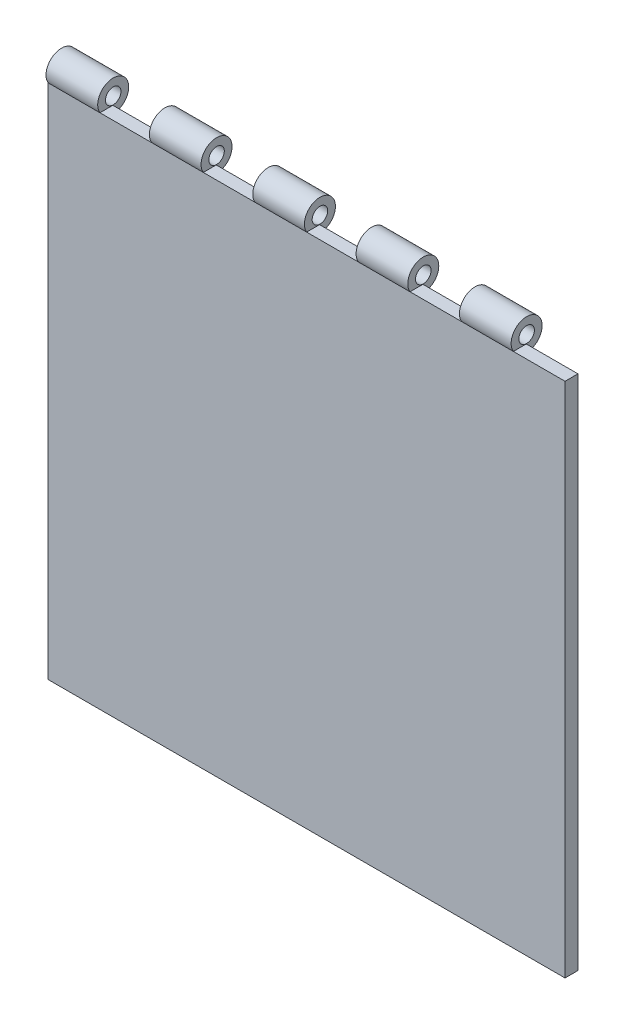
ISO-10303-21;
HEADER;
FILE_DESCRIPTION(('STEP AP214'),'2;1');
FILE_NAME('part.step','',(''),(''),'','','');
FILE_SCHEMA(('AUTOMOTIVE_DESIGN { 1 0 10303 214 1 1 1 1 }'));
ENDSEC;
DATA;
#1=APPLICATION_CONTEXT('core data for automotive mechanical design processes');
#2=APPLICATION_PROTOCOL_DEFINITION('international standard','automotive_design',2000,#1);
#3=PRODUCT_CONTEXT('',#1,'mechanical');
#4=PRODUCT('Part','Part','',(#3));
#5=PRODUCT_RELATED_PRODUCT_CATEGORY('part','',(#4));
#6=PRODUCT_DEFINITION_FORMATION('','',#4);
#7=PRODUCT_DEFINITION_CONTEXT('part definition',#1,'design');
#8=PRODUCT_DEFINITION('design','',#6,#7);
#9=PRODUCT_DEFINITION_SHAPE('','',#8);
#10=(LENGTH_UNIT() NAMED_UNIT(*) SI_UNIT(.MILLI.,.METRE.));
#11=(NAMED_UNIT(*) PLANE_ANGLE_UNIT() SI_UNIT($,.RADIAN.));
#12=(NAMED_UNIT(*) SI_UNIT($,.STERADIAN.) SOLID_ANGLE_UNIT());
#13=UNCERTAINTY_MEASURE_WITH_UNIT(LENGTH_MEASURE(1.E-05),#10,'distance_accuracy_value','');
#14=(GEOMETRIC_REPRESENTATION_CONTEXT(3) GLOBAL_UNCERTAINTY_ASSIGNED_CONTEXT((#13)) GLOBAL_UNIT_ASSIGNED_CONTEXT((#10,
#11,#12)) REPRESENTATION_CONTEXT('',''));
#15=CARTESIAN_POINT('',(0.,0.,0.));
#16=DIRECTION('',(0.,0.,1.));
#17=DIRECTION('',(1.,0.,0.));
#18=AXIS2_PLACEMENT_3D('',#15,#16,#17);
#19=CARTESIAN_POINT('',(12.6542998422668,241.773790352499,2.8441251796313));
#20=DIRECTION('',(0.,-1.,0.));
#21=DIRECTION('',(0.,0.,-1.));
#22=AXIS2_PLACEMENT_3D('',#19,#20,#21);
#23=PLANE('',#22);
#24=DIRECTION('',(0.,0.,-1.));
#25=VECTOR('',#24,1.);
#26=CARTESIAN_POINT('',(218.394299842267,241.773790352499,2.8441251796313));
#27=LINE('',#26,#25);
#28=CARTESIAN_POINT('',(218.394299842267,241.773790352499,2.8441251796313));
#29=VERTEX_POINT('',#28);
#30=CARTESIAN_POINT('',(218.394299842267,241.773790352499,-2.8708748203687));
#31=VERTEX_POINT('',#30);
#32=EDGE_CURVE('E164',#29,#31,#27,.T.);
#33=ORIENTED_EDGE('',*,*,#32,.F.);
#34=DIRECTION('',(-1.,0.,0.));
#35=VECTOR('',#34,1.);
#36=CARTESIAN_POINT('',(12.6542998422668,241.773790352499,2.8441251796313));
#37=LINE('',#36,#35);
#38=CARTESIAN_POINT('',(241.254299842267,241.773790352499,2.8441251796313));
#39=VERTEX_POINT('',#38);
#40=EDGE_CURVE('E279',#39,#29,#37,.T.);
#41=ORIENTED_EDGE('',*,*,#40,.F.);
#42=DIRECTION('',(0.,0.,-1.));
#43=VECTOR('',#42,1.);
#44=CARTESIAN_POINT('',(241.254299842267,241.773790352499,2.8441251796313));
#45=LINE('',#44,#43);
#46=CARTESIAN_POINT('',(241.254299842267,241.773790352499,-2.8708748203687));
#47=VERTEX_POINT('',#46);
#48=EDGE_CURVE('E282',#39,#47,#45,.T.);
#49=ORIENTED_EDGE('',*,*,#48,.T.);
#50=DIRECTION('',(-1.,0.,0.));
#51=VECTOR('',#50,1.);
#52=CARTESIAN_POINT('',(12.6542998422668,241.773790352499,-2.8708748203687));
#53=LINE('',#52,#51);
#54=EDGE_CURVE('E274',#47,#31,#53,.T.);
#55=ORIENTED_EDGE('',*,*,#54,.T.);
#56=EDGE_LOOP('',(#33,#41,#49,#55));
#57=FACE_BOUND('',#56,.T.);
#58=ADVANCED_FACE('F34',(#57),#23,.F.);
#59=CARTESIAN_POINT('',(12.6542998422669,13.1737903524993,-2.8708748203687));
#60=DIRECTION('',(0.,0.,-1.));
#61=DIRECTION('',(-1.,0.,0.));
#62=AXIS2_PLACEMENT_3D('',#59,#60,#61);
#63=PLANE('',#62);
#64=DIRECTION('',(-1.,0.,0.));
#65=VECTOR('',#64,1.);
#66=CARTESIAN_POINT('',(218.394299842267,238.451605653609,-2.8708748203687));
#67=LINE('',#66,#65);
#68=CARTESIAN_POINT('',(218.394299842267,238.451605653609,-2.8708748203687));
#69=VERTEX_POINT('',#68);
#70=CARTESIAN_POINT('',(195.534299842267,238.451605653609,-2.8708748203687));
#71=VERTEX_POINT('',#70);
#72=EDGE_CURVE('E156',#69,#71,#67,.T.);
#73=ORIENTED_EDGE('',*,*,#72,.F.);
#74=DIRECTION('',(0.,1.,0.));
#75=VECTOR('',#74,1.);
#76=CARTESIAN_POINT('',(218.394299842267,13.1737903524994,-2.8708748203687));
#77=LINE('',#76,#75);
#78=EDGE_CURVE('E179',#69,#31,#77,.T.);
#79=ORIENTED_EDGE('',*,*,#78,.T.);
#80=ORIENTED_EDGE('',*,*,#54,.F.);
#81=DIRECTION('',(0.,1.,0.));
#82=VECTOR('',#81,1.);
#83=CARTESIAN_POINT('',(241.254299842267,13.1737903524993,-2.8708748203687));
#84=LINE('',#83,#82);
#85=CARTESIAN_POINT('',(241.254299842267,13.1737903524993,-2.8708748203687));
#86=VERTEX_POINT('',#85);
#87=EDGE_CURVE('E288',#86,#47,#84,.T.);
#88=ORIENTED_EDGE('',*,*,#87,.F.);
#89=DIRECTION('',(1.,0.,0.));
#90=VECTOR('',#89,1.);
#91=CARTESIAN_POINT('',(12.6542998422669,13.1737903524993,-2.8708748203687));
#92=LINE('',#91,#90);
#93=CARTESIAN_POINT('',(12.6542998422669,13.1737903524993,-2.8708748203687));
#94=VERTEX_POINT('',#93);
#95=EDGE_CURVE('E286',#94,#86,#92,.T.);
#96=ORIENTED_EDGE('',*,*,#95,.F.);
#97=DIRECTION('',(0.,-1.,0.));
#98=VECTOR('',#97,1.);
#99=CARTESIAN_POINT('',(12.6542998422669,13.1737903524993,-2.8708748203687));
#100=LINE('',#99,#98);
#101=CARTESIAN_POINT('',(12.6542998422668,238.451605653609,-2.8708748203687));
#102=VERTEX_POINT('',#101);
#103=EDGE_CURVE('E269',#102,#94,#100,.T.);
#104=ORIENTED_EDGE('',*,*,#103,.F.);
#105=DIRECTION('',(-1.,0.,0.));
#106=VECTOR('',#105,1.);
#107=CARTESIAN_POINT('',(35.5142998422669,238.451605653609,-2.8708748203687));
#108=LINE('',#107,#106);
#109=CARTESIAN_POINT('',(35.5142998422669,238.451605653609,-2.8708748203687));
#110=VERTEX_POINT('',#109);
#111=EDGE_CURVE('E304',#110,#102,#108,.T.);
#112=ORIENTED_EDGE('',*,*,#111,.F.);
#113=DIRECTION('',(0.,1.,0.));
#114=VECTOR('',#113,1.);
#115=CARTESIAN_POINT('',(35.514299842267,13.1737903524993,-2.8708748203687));
#116=LINE('',#115,#114);
#117=CARTESIAN_POINT('',(35.5142998422669,241.773790352499,-2.8708748203687));
#118=VERTEX_POINT('',#117);
#119=EDGE_CURVE('E301',#110,#118,#116,.T.);
#120=ORIENTED_EDGE('',*,*,#119,.T.);
#121=CARTESIAN_POINT('',(58.3742998422668,241.773790352499,-2.8708748203687));
#122=VERTEX_POINT('',#121);
#123=EDGE_CURVE('E290',#122,#118,#53,.T.);
#124=ORIENTED_EDGE('',*,*,#123,.F.);
#125=DIRECTION('',(0.,1.,0.));
#126=VECTOR('',#125,1.);
#127=CARTESIAN_POINT('',(58.3742998422669,13.1737903524993,-2.8708748203687));
#128=LINE('',#127,#126);
#129=CARTESIAN_POINT('',(58.3742998422668,238.451605653609,-2.8708748203687));
#130=VERTEX_POINT('',#129);
#131=EDGE_CURVE('E307',#130,#122,#128,.T.);
#132=ORIENTED_EDGE('',*,*,#131,.F.);
#133=DIRECTION('',(-1.,0.,0.));
#134=VECTOR('',#133,1.);
#135=CARTESIAN_POINT('',(81.2342998422669,238.451605653609,-2.8708748203687));
#136=LINE('',#135,#134);
#137=CARTESIAN_POINT('',(81.2342998422669,238.451605653609,-2.8708748203687));
#138=VERTEX_POINT('',#137);
#139=EDGE_CURVE('E42',#138,#130,#136,.T.);
#140=ORIENTED_EDGE('',*,*,#139,.F.);
#141=DIRECTION('',(0.,1.,0.));
#142=VECTOR('',#141,1.);
#143=CARTESIAN_POINT('',(81.234299842267,13.1737903524993,-2.8708748203687));
#144=LINE('',#143,#142);
#145=CARTESIAN_POINT('',(81.2342998422669,241.773790352499,-2.8708748203687));
#146=VERTEX_POINT('',#145);
#147=EDGE_CURVE('E11',#138,#146,#144,.T.);
#148=ORIENTED_EDGE('',*,*,#147,.T.);
#149=CARTESIAN_POINT('',(104.094299842267,241.773790352499,-2.8708748203687));
#150=VERTEX_POINT('',#149);
#151=EDGE_CURVE('E334',#150,#146,#53,.T.);
#152=ORIENTED_EDGE('',*,*,#151,.F.);
#153=DIRECTION('',(0.,1.,0.));
#154=VECTOR('',#153,1.);
#155=CARTESIAN_POINT('',(104.094299842267,13.1737903524993,-2.8708748203687));
#156=LINE('',#155,#154);
#157=CARTESIAN_POINT('',(104.094299842267,238.451605653609,-2.8708748203687));
#158=VERTEX_POINT('',#157);
#159=EDGE_CURVE('E216',#158,#150,#156,.T.);
#160=ORIENTED_EDGE('',*,*,#159,.F.);
#161=DIRECTION('',(-1.,0.,0.));
#162=VECTOR('',#161,1.);
#163=CARTESIAN_POINT('',(126.954299842267,238.451605653609,-2.8708748203687));
#164=LINE('',#163,#162);
#165=CARTESIAN_POINT('',(126.954299842267,238.451605653609,-2.8708748203687));
#166=VERTEX_POINT('',#165);
#167=EDGE_CURVE('E229',#166,#158,#164,.T.);
#168=ORIENTED_EDGE('',*,*,#167,.F.);
#169=DIRECTION('',(0.,1.,0.));
#170=VECTOR('',#169,1.);
#171=CARTESIAN_POINT('',(126.954299842267,13.1737903524993,-2.8708748203687));
#172=LINE('',#171,#170);
#173=CARTESIAN_POINT('',(126.954299842267,241.773790352499,-2.8708748203687));
#174=VERTEX_POINT('',#173);
#175=EDGE_CURVE('E223',#166,#174,#172,.T.);
#176=ORIENTED_EDGE('',*,*,#175,.T.);
#177=CARTESIAN_POINT('',(149.814299842267,241.773790352499,-2.8708748203687));
#178=VERTEX_POINT('',#177);
#179=EDGE_CURVE('E337',#178,#174,#53,.T.);
#180=ORIENTED_EDGE('',*,*,#179,.F.);
#181=DIRECTION('',(0.,1.,0.));
#182=VECTOR('',#181,1.);
#183=CARTESIAN_POINT('',(149.814299842267,13.1737903524993,-2.8708748203687));
#184=LINE('',#183,#182);
#185=CARTESIAN_POINT('',(149.814299842267,238.451605653609,-2.8708748203687));
#186=VERTEX_POINT('',#185);
#187=EDGE_CURVE('E193',#186,#178,#184,.T.);
#188=ORIENTED_EDGE('',*,*,#187,.F.);
#189=DIRECTION('',(-1.,0.,0.));
#190=VECTOR('',#189,1.);
#191=CARTESIAN_POINT('',(172.674299842267,238.451605653609,-2.8708748203687));
#192=LINE('',#191,#190);
#193=CARTESIAN_POINT('',(172.674299842267,238.451605653609,-2.8708748203687));
#194=VERTEX_POINT('',#193);
#195=EDGE_CURVE('E204',#194,#186,#192,.T.);
#196=ORIENTED_EDGE('',*,*,#195,.F.);
#197=DIRECTION('',(0.,1.,0.));
#198=VECTOR('',#197,1.);
#199=CARTESIAN_POINT('',(172.674299842267,13.1737903524994,-2.8708748203687));
#200=LINE('',#199,#198);
#201=CARTESIAN_POINT('',(172.674299842267,241.773790352499,-2.8708748203687));
#202=VERTEX_POINT('',#201);
#203=EDGE_CURVE('E199',#194,#202,#200,.T.);
#204=ORIENTED_EDGE('',*,*,#203,.T.);
#205=CARTESIAN_POINT('',(195.534299842267,241.773790352499,-2.8708748203687));
#206=VERTEX_POINT('',#205);
#207=EDGE_CURVE('E177',#206,#202,#53,.T.);
#208=ORIENTED_EDGE('',*,*,#207,.F.);
#209=DIRECTION('',(0.,1.,0.));
#210=VECTOR('',#209,1.);
#211=CARTESIAN_POINT('',(195.534299842267,13.1737903524994,-2.8708748203687));
#212=LINE('',#211,#210);
#213=EDGE_CURVE('E168',#71,#206,#212,.T.);
#214=ORIENTED_EDGE('',*,*,#213,.F.);
#215=EDGE_LOOP('',(#73,#79,#80,#88,#96,#104,#112,#120,#124,#132,#140,#148,#152,#160,#168,#176,
#180,#188,#196,#204,#208,#214));
#216=FACE_BOUND('',#215,.T.);
#217=ADVANCED_FACE('F175',(#216),#63,.T.);
#218=CARTESIAN_POINT('',(195.534299842267,241.773790352499,2.8441251796313));
#219=VERTEX_POINT('',#218);
#220=CARTESIAN_POINT('',(172.674299842267,241.773790352499,2.8441251796313));
#221=VERTEX_POINT('',#220);
#222=EDGE_CURVE('E284',#219,#221,#37,.T.);
#223=ORIENTED_EDGE('',*,*,#222,.F.);
#224=DIRECTION('',(0.,0.,-1.));
#225=VECTOR('',#224,1.);
#226=CARTESIAN_POINT('',(195.534299842267,241.773790352499,2.8441251796313));
#227=LINE('',#226,#225);
#228=EDGE_CURVE('E170',#219,#206,#227,.T.);
#229=ORIENTED_EDGE('',*,*,#228,.T.);
#230=ORIENTED_EDGE('',*,*,#207,.T.);
#231=DIRECTION('',(0.,0.,-1.));
#232=VECTOR('',#231,1.);
#233=CARTESIAN_POINT('',(172.674299842267,241.773790352499,2.8441251796313));
#234=LINE('',#233,#232);
#235=EDGE_CURVE('E201',#221,#202,#234,.T.);
#236=ORIENTED_EDGE('',*,*,#235,.F.);
#237=EDGE_LOOP('',(#223,#229,#230,#236));
#238=FACE_BOUND('',#237,.T.);
#239=ADVANCED_FACE('F343',(#238),#23,.F.);
#240=CARTESIAN_POINT('',(149.814299842267,241.773790352499,2.8441251796313));
#241=VERTEX_POINT('',#240);
#242=CARTESIAN_POINT('',(126.954299842267,241.773790352499,2.8441251796313));
#243=VERTEX_POINT('',#242);
#244=EDGE_CURVE('E353',#241,#243,#37,.T.);
#245=ORIENTED_EDGE('',*,*,#244,.F.);
#246=DIRECTION('',(0.,0.,-1.));
#247=VECTOR('',#246,1.);
#248=CARTESIAN_POINT('',(149.814299842267,241.773790352499,2.8441251796313));
#249=LINE('',#248,#247);
#250=EDGE_CURVE('E196',#241,#178,#249,.T.);
#251=ORIENTED_EDGE('',*,*,#250,.T.);
#252=ORIENTED_EDGE('',*,*,#179,.T.);
#253=DIRECTION('',(0.,0.,-1.));
#254=VECTOR('',#253,1.);
#255=CARTESIAN_POINT('',(126.954299842267,241.773790352499,2.8441251796313));
#256=LINE('',#255,#254);
#257=EDGE_CURVE('E226',#243,#174,#256,.T.);
#258=ORIENTED_EDGE('',*,*,#257,.F.);
#259=EDGE_LOOP('',(#245,#251,#252,#258));
#260=FACE_BOUND('',#259,.T.);
#261=ADVANCED_FACE('F355',(#260),#23,.F.);
#262=CARTESIAN_POINT('',(104.094299842267,241.773790352499,2.8441251796313));
#263=VERTEX_POINT('',#262);
#264=CARTESIAN_POINT('',(81.2342998422669,241.773790352499,2.8441251796313));
#265=VERTEX_POINT('',#264);
#266=EDGE_CURVE('E324',#263,#265,#37,.T.);
#267=ORIENTED_EDGE('',*,*,#266,.F.);
#268=DIRECTION('',(0.,0.,-1.));
#269=VECTOR('',#268,1.);
#270=CARTESIAN_POINT('',(104.094299842267,241.773790352499,2.8441251796313));
#271=LINE('',#270,#269);
#272=EDGE_CURVE('E220',#263,#150,#271,.T.);
#273=ORIENTED_EDGE('',*,*,#272,.T.);
#274=ORIENTED_EDGE('',*,*,#151,.T.);
#275=DIRECTION('',(0.,0.,-1.));
#276=VECTOR('',#275,1.);
#277=CARTESIAN_POINT('',(81.2342998422669,241.773790352499,2.8441251796313));
#278=LINE('',#277,#276);
#279=EDGE_CURVE('E246',#265,#146,#278,.T.);
#280=ORIENTED_EDGE('',*,*,#279,.F.);
#281=EDGE_LOOP('',(#267,#273,#274,#280));
#282=FACE_BOUND('',#281,.T.);
#283=ADVANCED_FACE('F367',(#282),#23,.F.);
#284=CARTESIAN_POINT('',(58.3742998422668,241.773790352499,2.8441251796313));
#285=VERTEX_POINT('',#284);
#286=CARTESIAN_POINT('',(35.5142998422669,241.773790352499,2.8441251796313));
#287=VERTEX_POINT('',#286);
#288=EDGE_CURVE('E278',#285,#287,#37,.T.);
#289=ORIENTED_EDGE('',*,*,#288,.F.);
#290=DIRECTION('',(0.,0.,-1.));
#291=VECTOR('',#290,1.);
#292=CARTESIAN_POINT('',(58.3742998422668,241.773790352499,2.8441251796313));
#293=LINE('',#292,#291);
#294=EDGE_CURVE('E241',#285,#122,#293,.T.);
#295=ORIENTED_EDGE('',*,*,#294,.T.);
#296=ORIENTED_EDGE('',*,*,#123,.T.);
#297=DIRECTION('',(0.,0.,-1.));
#298=VECTOR('',#297,1.);
#299=CARTESIAN_POINT('',(35.5142998422669,241.773790352499,2.8441251796313));
#300=LINE('',#299,#298);
#301=EDGE_CURVE('E262',#287,#118,#300,.T.);
#302=ORIENTED_EDGE('',*,*,#301,.F.);
#303=EDGE_LOOP('',(#289,#295,#296,#302));
#304=FACE_BOUND('',#303,.T.);
#305=ADVANCED_FACE('F320',(#304),#23,.F.);
#306=CARTESIAN_POINT('',(12.6542998422669,13.1737903524993,2.8441251796313));
#307=DIRECTION('',(1.,0.,0.));
#308=DIRECTION('',(0.,1.,0.));
#309=AXIS2_PLACEMENT_3D('',#306,#307,#308);
#310=PLANE('',#309);
#311=DIRECTION('',(0.,-1.,0.));
#312=VECTOR('',#311,1.);
#313=CARTESIAN_POINT('',(12.6542998422669,13.1737903524993,2.8441251796313));
#314=LINE('',#313,#312);
#315=CARTESIAN_POINT('',(12.6542998422668,241.773790352499,2.8441251796313));
#316=VERTEX_POINT('',#315);
#317=CARTESIAN_POINT('',(12.6542998422669,13.1737903524993,2.8441251796313));
#318=VERTEX_POINT('',#317);
#319=EDGE_CURVE('E270',#316,#318,#314,.T.);
#320=ORIENTED_EDGE('',*,*,#319,.F.);
#321=CARTESIAN_POINT('',(12.6542998422668,245.307682661814,-3.03326957877705));
#322=DIRECTION('',(-1.,0.,0.));
#323=DIRECTION('',(0.,-1.,0.));
#324=AXIS2_PLACEMENT_3D('',#321,#322,#323);
#325=CIRCLE('',#324,6.85800000000001);
#326=EDGE_CURVE('E256',#316,#102,#325,.T.);
#327=ORIENTED_EDGE('',*,*,#326,.T.);
#328=ORIENTED_EDGE('',*,*,#103,.T.);
#329=DIRECTION('',(0.,0.,-1.));
#330=VECTOR('',#329,1.);
#331=CARTESIAN_POINT('',(12.6542998422669,13.1737903524993,2.8441251796313));
#332=LINE('',#331,#330);
#333=EDGE_CURVE('E298',#318,#94,#332,.T.);
#334=ORIENTED_EDGE('',*,*,#333,.F.);
#335=EDGE_LOOP('',(#320,#327,#328,#334));
#336=FACE_BOUND('',#335,.T.);
#337=CARTESIAN_POINT('',(12.6542998422668,245.307682661814,-3.03326957877705));
#338=DIRECTION('',(-1.,0.,0.));
#339=DIRECTION('',(0.,-1.,0.));
#340=AXIS2_PLACEMENT_3D('',#337,#338,#339);
#341=CIRCLE('',#340,3.429);
#342=CARTESIAN_POINT('',(12.6542998422668,241.878682661814,-3.03326957877705));
#343=VERTEX_POINT('',#342);
#344=EDGE_CURVE('E252',#343,#343,#341,.T.);
#345=ORIENTED_EDGE('',*,*,#344,.F.);
#346=EDGE_LOOP('',(#345));
#347=FACE_BOUND('',#346,.T.);
#348=ADVANCED_FACE('F36',(#336,#347),#310,.F.);
#349=CARTESIAN_POINT('',(12.6542998422669,13.1737903524993,2.8441251796313));
#350=DIRECTION('',(0.,1.,0.));
#351=DIRECTION('',(0.,0.,1.));
#352=AXIS2_PLACEMENT_3D('',#349,#350,#351);
#353=PLANE('',#352);
#354=ORIENTED_EDGE('',*,*,#95,.T.);
#355=DIRECTION('',(0.,0.,-1.));
#356=VECTOR('',#355,1.);
#357=CARTESIAN_POINT('',(241.254299842267,13.1737903524993,2.8441251796313));
#358=LINE('',#357,#356);
#359=CARTESIAN_POINT('',(241.254299842267,13.1737903524993,2.8441251796313));
#360=VERTEX_POINT('',#359);
#361=EDGE_CURVE('E295',#360,#86,#358,.T.);
#362=ORIENTED_EDGE('',*,*,#361,.F.);
#363=DIRECTION('',(1.,0.,0.));
#364=VECTOR('',#363,1.);
#365=CARTESIAN_POINT('',(12.6542998422669,13.1737903524993,2.8441251796313));
#366=LINE('',#365,#364);
#367=EDGE_CURVE('E273',#318,#360,#366,.T.);
#368=ORIENTED_EDGE('',*,*,#367,.F.);
#369=ORIENTED_EDGE('',*,*,#333,.T.);
#370=EDGE_LOOP('',(#354,#362,#368,#369));
#371=FACE_BOUND('',#370,.T.);
#372=ADVANCED_FACE('F411',(#371),#353,.F.);
#373=CARTESIAN_POINT('',(241.254299842267,13.1737903524993,2.8441251796313));
#374=DIRECTION('',(-1.,0.,0.));
#375=DIRECTION('',(0.,-1.,0.));
#376=AXIS2_PLACEMENT_3D('',#373,#374,#375);
#377=PLANE('',#376);
#378=ORIENTED_EDGE('',*,*,#87,.T.);
#379=ORIENTED_EDGE('',*,*,#48,.F.);
#380=DIRECTION('',(0.,1.,0.));
#381=VECTOR('',#380,1.);
#382=CARTESIAN_POINT('',(241.254299842267,13.1737903524993,2.8441251796313));
#383=LINE('',#382,#381);
#384=EDGE_CURVE('E276',#360,#39,#383,.T.);
#385=ORIENTED_EDGE('',*,*,#384,.F.);
#386=ORIENTED_EDGE('',*,*,#361,.T.);
#387=EDGE_LOOP('',(#378,#379,#385,#386));
#388=FACE_BOUND('',#387,.T.);
#389=ADVANCED_FACE('F422',(#388),#377,.F.);
#390=CARTESIAN_POINT('',(12.6542998422669,13.1737903524993,2.8441251796313));
#391=DIRECTION('',(0.,0.,-1.));
#392=DIRECTION('',(-1.,0.,0.));
#393=AXIS2_PLACEMENT_3D('',#390,#391,#392);
#394=PLANE('',#393);
#395=ORIENTED_EDGE('',*,*,#319,.T.);
#396=ORIENTED_EDGE('',*,*,#367,.T.);
#397=ORIENTED_EDGE('',*,*,#384,.T.);
#398=ORIENTED_EDGE('',*,*,#40,.T.);
#399=EDGE_CURVE('E283',#29,#219,#37,.T.);
#400=ORIENTED_EDGE('',*,*,#399,.T.);
#401=ORIENTED_EDGE('',*,*,#222,.T.);
#402=EDGE_CURVE('E357',#221,#241,#37,.T.);
#403=ORIENTED_EDGE('',*,*,#402,.T.);
#404=ORIENTED_EDGE('',*,*,#244,.T.);
#405=EDGE_CURVE('E325',#243,#263,#37,.T.);
#406=ORIENTED_EDGE('',*,*,#405,.T.);
#407=ORIENTED_EDGE('',*,*,#266,.T.);
#408=DIRECTION('',(-1.,0.,0.));
#409=VECTOR('',#408,1.);
#410=CARTESIAN_POINT('',(81.2342998422669,241.773790352499,2.8441251796313));
#411=LINE('',#410,#409);
#412=EDGE_CURVE('E249',#265,#285,#411,.T.);
#413=ORIENTED_EDGE('',*,*,#412,.T.);
#414=ORIENTED_EDGE('',*,*,#288,.T.);
#415=DIRECTION('',(-1.,0.,0.));
#416=VECTOR('',#415,1.);
#417=CARTESIAN_POINT('',(35.5142998422669,241.773790352499,2.8441251796313));
#418=LINE('',#417,#416);
#419=EDGE_CURVE('E266',#287,#316,#418,.T.);
#420=ORIENTED_EDGE('',*,*,#419,.T.);
#421=EDGE_LOOP('',(#395,#396,#397,#398,#400,#401,#403,#404,#406,#407,#413,#414,#420));
#422=FACE_BOUND('',#421,.T.);
#423=ADVANCED_FACE('F326',(#422),#394,.F.);
#424=CARTESIAN_POINT('',(35.5142998422669,245.307682661814,-3.03326957877705));
#425=DIRECTION('',(-1.,0.,0.));
#426=DIRECTION('',(0.,-1.,0.));
#427=AXIS2_PLACEMENT_3D('',#424,#425,#426);
#428=CYLINDRICAL_SURFACE('',#427,6.85800000000001);
#429=ORIENTED_EDGE('',*,*,#419,.F.);
#430=CARTESIAN_POINT('',(35.5142998422669,245.307682661814,-3.03326957877705));
#431=DIRECTION('',(-1.,0.,0.));
#432=DIRECTION('',(0.,-1.,0.));
#433=AXIS2_PLACEMENT_3D('',#430,#431,#432);
#434=CIRCLE('',#433,6.85800000000001);
#435=EDGE_CURVE('E259',#287,#110,#434,.T.);
#436=ORIENTED_EDGE('',*,*,#435,.T.);
#437=ORIENTED_EDGE('',*,*,#111,.T.);
#438=ORIENTED_EDGE('',*,*,#326,.F.);
#439=EDGE_LOOP('',(#429,#436,#437,#438));
#440=FACE_BOUND('',#439,.T.);
#441=ADVANCED_FACE('F439',(#440),#428,.T.);
#442=CARTESIAN_POINT('',(35.5142998422669,245.307682661814,-3.03326957877705));
#443=DIRECTION('',(-1.,0.,0.));
#444=DIRECTION('',(0.,-1.,0.));
#445=AXIS2_PLACEMENT_3D('',#442,#443,#444);
#446=PLANE('',#445);
#447=CARTESIAN_POINT('',(35.5142998422669,245.307682661814,-3.03326957877705));
#448=DIRECTION('',(-1.,0.,0.));
#449=DIRECTION('',(0.,-1.,0.));
#450=AXIS2_PLACEMENT_3D('',#447,#448,#449);
#451=CIRCLE('',#450,3.429);
#452=CARTESIAN_POINT('',(35.5142998422669,241.878682661814,-3.03326957877705));
#453=VERTEX_POINT('',#452);
#454=EDGE_CURVE('E253',#453,#453,#451,.T.);
#455=ORIENTED_EDGE('',*,*,#454,.T.);
#456=EDGE_LOOP('',(#455));
#457=FACE_BOUND('',#456,.T.);
#458=ORIENTED_EDGE('',*,*,#435,.F.);
#459=ORIENTED_EDGE('',*,*,#301,.T.);
#460=ORIENTED_EDGE('',*,*,#119,.F.);
#461=EDGE_LOOP('',(#458,#459,#460));
#462=FACE_BOUND('',#461,.T.);
#463=ADVANCED_FACE('F448',(#457,#462),#446,.F.);
#464=CARTESIAN_POINT('',(35.5142998422669,245.307682661814,-3.03326957877705));
#465=DIRECTION('',(-1.,0.,0.));
#466=DIRECTION('',(0.,-1.,0.));
#467=AXIS2_PLACEMENT_3D('',#464,#465,#466);
#468=CYLINDRICAL_SURFACE('',#467,3.429);
#469=ORIENTED_EDGE('',*,*,#454,.F.);
#470=EDGE_LOOP('',(#469));
#471=FACE_BOUND('',#470,.T.);
#472=ORIENTED_EDGE('',*,*,#344,.T.);
#473=EDGE_LOOP('',(#472));
#474=FACE_BOUND('',#473,.T.);
#475=ADVANCED_FACE('F458',(#471,#474),#468,.F.);
#476=CARTESIAN_POINT('',(81.2342998422669,245.307682661814,-3.03326957877705));
#477=DIRECTION('',(-1.,0.,0.));
#478=DIRECTION('',(0.,-1.,0.));
#479=AXIS2_PLACEMENT_3D('',#476,#477,#478);
#480=CYLINDRICAL_SURFACE('',#479,6.85800000000001);
#481=ORIENTED_EDGE('',*,*,#412,.F.);
#482=CARTESIAN_POINT('',(81.2342998422669,245.307682661814,-3.03326957877705));
#483=DIRECTION('',(-1.,0.,0.));
#484=DIRECTION('',(0.,-1.,0.));
#485=AXIS2_PLACEMENT_3D('',#482,#483,#484);
#486=CIRCLE('',#485,6.85800000000001);
#487=EDGE_CURVE('E238',#265,#138,#486,.T.);
#488=ORIENTED_EDGE('',*,*,#487,.T.);
#489=ORIENTED_EDGE('',*,*,#139,.T.);
#490=CARTESIAN_POINT('',(58.3742998422668,245.307682661814,-3.03326957877705));
#491=DIRECTION('',(-1.,0.,0.));
#492=DIRECTION('',(0.,-1.,0.));
#493=AXIS2_PLACEMENT_3D('',#490,#491,#492);
#494=CIRCLE('',#493,6.85800000000001);
#495=EDGE_CURVE('E235',#285,#130,#494,.T.);
#496=ORIENTED_EDGE('',*,*,#495,.F.);
#497=EDGE_LOOP('',(#481,#488,#489,#496));
#498=FACE_BOUND('',#497,.T.);
#499=ADVANCED_FACE('F313',(#498),#480,.T.);
#500=CARTESIAN_POINT('',(81.2342998422669,245.307682661814,-3.03326957877705));
#501=DIRECTION('',(-1.,0.,0.));
#502=DIRECTION('',(0.,-1.,0.));
#503=AXIS2_PLACEMENT_3D('',#500,#501,#502);
#504=PLANE('',#503);
#505=CARTESIAN_POINT('',(81.2342998422669,245.307682661814,-3.03326957877705));
#506=DIRECTION('',(-1.,0.,0.));
#507=DIRECTION('',(0.,-1.,0.));
#508=AXIS2_PLACEMENT_3D('',#505,#506,#507);
#509=CIRCLE('',#508,3.429);
#510=CARTESIAN_POINT('',(81.2342998422669,241.878682661814,-3.03326957877705));
#511=VERTEX_POINT('',#510);
#512=EDGE_CURVE('E232',#511,#511,#509,.T.);
#513=ORIENTED_EDGE('',*,*,#512,.T.);
#514=EDGE_LOOP('',(#513));
#515=FACE_BOUND('',#514,.T.);
#516=ORIENTED_EDGE('',*,*,#487,.F.);
#517=ORIENTED_EDGE('',*,*,#279,.T.);
#518=ORIENTED_EDGE('',*,*,#147,.F.);
#519=EDGE_LOOP('',(#516,#517,#518));
#520=FACE_BOUND('',#519,.T.);
#521=ADVANCED_FACE('F331',(#515,#520),#504,.F.);
#522=CARTESIAN_POINT('',(58.3742998422668,245.307682661814,-3.03326957877705));
#523=DIRECTION('',(-1.,0.,0.));
#524=DIRECTION('',(0.,-1.,0.));
#525=AXIS2_PLACEMENT_3D('',#522,#523,#524);
#526=PLANE('',#525);
#527=CARTESIAN_POINT('',(58.3742998422668,245.307682661814,-3.03326957877705));
#528=DIRECTION('',(-1.,0.,0.));
#529=DIRECTION('',(0.,-1.,0.));
#530=AXIS2_PLACEMENT_3D('',#527,#528,#529);
#531=CIRCLE('',#530,3.429);
#532=CARTESIAN_POINT('',(58.3742998422668,241.878682661814,-3.03326957877705));
#533=VERTEX_POINT('',#532);
#534=EDGE_CURVE('E231',#533,#533,#531,.T.);
#535=ORIENTED_EDGE('',*,*,#534,.F.);
#536=EDGE_LOOP('',(#535));
#537=FACE_BOUND('',#536,.T.);
#538=ORIENTED_EDGE('',*,*,#294,.F.);
#539=ORIENTED_EDGE('',*,*,#495,.T.);
#540=ORIENTED_EDGE('',*,*,#131,.T.);
#541=EDGE_LOOP('',(#538,#539,#540));
#542=FACE_BOUND('',#541,.T.);
#543=ADVANCED_FACE('F318',(#537,#542),#526,.T.);
#544=CARTESIAN_POINT('',(81.2342998422669,245.307682661814,-3.03326957877705));
#545=DIRECTION('',(-1.,0.,0.));
#546=DIRECTION('',(0.,-1.,0.));
#547=AXIS2_PLACEMENT_3D('',#544,#545,#546);
#548=CYLINDRICAL_SURFACE('',#547,3.429);
#549=ORIENTED_EDGE('',*,*,#512,.F.);
#550=EDGE_LOOP('',(#549));
#551=FACE_BOUND('',#550,.T.);
#552=ORIENTED_EDGE('',*,*,#534,.T.);
#553=EDGE_LOOP('',(#552));
#554=FACE_BOUND('',#553,.T.);
#555=ADVANCED_FACE('F496',(#551,#554),#548,.F.);
#556=CARTESIAN_POINT('',(126.954299842267,245.307682661814,-3.03326957877705));
#557=DIRECTION('',(-1.,0.,0.));
#558=DIRECTION('',(0.,-1.,0.));
#559=AXIS2_PLACEMENT_3D('',#556,#557,#558);
#560=PLANE('',#559);
#561=CARTESIAN_POINT('',(126.954299842267,245.307682661814,-3.03326957877705));
#562=DIRECTION('',(-1.,0.,0.));
#563=DIRECTION('',(0.,-1.,0.));
#564=AXIS2_PLACEMENT_3D('',#561,#562,#563);
#565=CIRCLE('',#564,3.429);
#566=CARTESIAN_POINT('',(126.954299842267,241.878682661814,-3.03326957877705));
#567=VERTEX_POINT('',#566);
#568=EDGE_CURVE('E207',#567,#567,#565,.T.);
#569=ORIENTED_EDGE('',*,*,#568,.T.);
#570=EDGE_LOOP('',(#569));
#571=FACE_BOUND('',#570,.T.);
#572=CARTESIAN_POINT('',(126.954299842267,245.307682661814,-3.03326957877705));
#573=DIRECTION('',(-1.,0.,0.));
#574=DIRECTION('',(0.,-1.,0.));
#575=AXIS2_PLACEMENT_3D('',#572,#573,#574);
#576=CIRCLE('',#575,6.85800000000001);
#577=EDGE_CURVE('E213',#243,#166,#576,.T.);
#578=ORIENTED_EDGE('',*,*,#577,.F.);
#579=ORIENTED_EDGE('',*,*,#257,.T.);
#580=ORIENTED_EDGE('',*,*,#175,.F.);
#581=EDGE_LOOP('',(#578,#579,#580));
#582=FACE_BOUND('',#581,.T.);
#583=ADVANCED_FACE('F364',(#571,#582),#560,.F.);
#584=CARTESIAN_POINT('',(104.094299842267,245.307682661814,-3.03326957877705));
#585=DIRECTION('',(-1.,0.,0.));
#586=DIRECTION('',(0.,-1.,0.));
#587=AXIS2_PLACEMENT_3D('',#584,#585,#586);
#588=PLANE('',#587);
#589=CARTESIAN_POINT('',(104.094299842267,245.307682661814,-3.03326957877705));
#590=DIRECTION('',(-1.,0.,0.));
#591=DIRECTION('',(0.,-1.,0.));
#592=AXIS2_PLACEMENT_3D('',#589,#590,#591);
#593=CIRCLE('',#592,3.429);
#594=CARTESIAN_POINT('',(104.094299842267,241.878682661814,-3.03326957877705));
#595=VERTEX_POINT('',#594);
#596=EDGE_CURVE('E206',#595,#595,#593,.T.);
#597=ORIENTED_EDGE('',*,*,#596,.F.);
#598=EDGE_LOOP('',(#597));
#599=FACE_BOUND('',#598,.T.);
#600=ORIENTED_EDGE('',*,*,#272,.F.);
#601=CARTESIAN_POINT('',(104.094299842267,245.307682661814,-3.03326957877705));
#602=DIRECTION('',(-1.,0.,0.));
#603=DIRECTION('',(0.,-1.,0.));
#604=AXIS2_PLACEMENT_3D('',#601,#602,#603);
#605=CIRCLE('',#604,6.85800000000001);
#606=EDGE_CURVE('E210',#263,#158,#605,.T.);
#607=ORIENTED_EDGE('',*,*,#606,.T.);
#608=ORIENTED_EDGE('',*,*,#159,.T.);
#609=EDGE_LOOP('',(#600,#607,#608));
#610=FACE_BOUND('',#609,.T.);
#611=ADVANCED_FACE('F366',(#599,#610),#588,.T.);
#612=CARTESIAN_POINT('',(126.954299842267,245.307682661814,-3.03326957877705));
#613=DIRECTION('',(-1.,0.,0.));
#614=DIRECTION('',(0.,-1.,0.));
#615=AXIS2_PLACEMENT_3D('',#612,#613,#614);
#616=CYLINDRICAL_SURFACE('',#615,6.85800000000001);
#617=ORIENTED_EDGE('',*,*,#577,.T.);
#618=ORIENTED_EDGE('',*,*,#167,.T.);
#619=ORIENTED_EDGE('',*,*,#606,.F.);
#620=ORIENTED_EDGE('',*,*,#405,.F.);
#621=EDGE_LOOP('',(#617,#618,#619,#620));
#622=FACE_BOUND('',#621,.T.);
#623=ADVANCED_FACE('F361',(#622),#616,.T.);
#624=CARTESIAN_POINT('',(126.954299842267,245.307682661814,-3.03326957877705));
#625=DIRECTION('',(-1.,0.,0.));
#626=DIRECTION('',(0.,-1.,0.));
#627=AXIS2_PLACEMENT_3D('',#624,#625,#626);
#628=CYLINDRICAL_SURFACE('',#627,3.429);
#629=ORIENTED_EDGE('',*,*,#568,.F.);
#630=EDGE_LOOP('',(#629));
#631=FACE_BOUND('',#630,.T.);
#632=ORIENTED_EDGE('',*,*,#596,.T.);
#633=EDGE_LOOP('',(#632));
#634=FACE_BOUND('',#633,.T.);
#635=ADVANCED_FACE('F533',(#631,#634),#628,.F.);
#636=CARTESIAN_POINT('',(172.674299842267,245.307682661814,-3.03326957877705));
#637=DIRECTION('',(-1.,0.,0.));
#638=DIRECTION('',(0.,-1.,0.));
#639=AXIS2_PLACEMENT_3D('',#636,#637,#638);
#640=PLANE('',#639);
#641=CARTESIAN_POINT('',(172.674299842267,245.307682661814,-3.03326957877705));
#642=DIRECTION('',(-1.,0.,0.));
#643=DIRECTION('',(0.,-1.,0.));
#644=AXIS2_PLACEMENT_3D('',#641,#642,#643);
#645=CIRCLE('',#644,3.429);
#646=CARTESIAN_POINT('',(172.674299842267,241.878682661814,-3.03326957877705));
#647=VERTEX_POINT('',#646);
#648=EDGE_CURVE('E185',#647,#647,#645,.T.);
#649=ORIENTED_EDGE('',*,*,#648,.T.);
#650=EDGE_LOOP('',(#649));
#651=FACE_BOUND('',#650,.T.);
#652=CARTESIAN_POINT('',(172.674299842267,245.307682661814,-3.03326957877705));
#653=DIRECTION('',(-1.,0.,0.));
#654=DIRECTION('',(0.,-1.,0.));
#655=AXIS2_PLACEMENT_3D('',#652,#653,#654);
#656=CIRCLE('',#655,6.85800000000001);
#657=EDGE_CURVE('E190',#221,#194,#656,.T.);
#658=ORIENTED_EDGE('',*,*,#657,.F.);
#659=ORIENTED_EDGE('',*,*,#235,.T.);
#660=ORIENTED_EDGE('',*,*,#203,.F.);
#661=EDGE_LOOP('',(#658,#659,#660));
#662=FACE_BOUND('',#661,.T.);
#663=ADVANCED_FACE('F346',(#651,#662),#640,.F.);
#664=CARTESIAN_POINT('',(149.814299842267,245.307682661814,-3.03326957877705));
#665=DIRECTION('',(-1.,0.,0.));
#666=DIRECTION('',(0.,-1.,0.));
#667=AXIS2_PLACEMENT_3D('',#664,#665,#666);
#668=PLANE('',#667);
#669=CARTESIAN_POINT('',(149.814299842267,245.307682661814,-3.03326957877705));
#670=DIRECTION('',(-1.,0.,0.));
#671=DIRECTION('',(0.,-1.,0.));
#672=AXIS2_PLACEMENT_3D('',#669,#670,#671);
#673=CIRCLE('',#672,3.429);
#674=CARTESIAN_POINT('',(149.814299842267,241.878682661814,-3.03326957877705));
#675=VERTEX_POINT('',#674);
#676=EDGE_CURVE('E163',#675,#675,#673,.T.);
#677=ORIENTED_EDGE('',*,*,#676,.F.);
#678=EDGE_LOOP('',(#677));
#679=FACE_BOUND('',#678,.T.);
#680=ORIENTED_EDGE('',*,*,#250,.F.);
#681=CARTESIAN_POINT('',(149.814299842267,245.307682661814,-3.03326957877705));
#682=DIRECTION('',(-1.,0.,0.));
#683=DIRECTION('',(0.,-1.,0.));
#684=AXIS2_PLACEMENT_3D('',#681,#682,#683);
#685=CIRCLE('',#684,6.85800000000001);
#686=EDGE_CURVE('E57',#241,#186,#685,.T.);
#687=ORIENTED_EDGE('',*,*,#686,.T.);
#688=ORIENTED_EDGE('',*,*,#187,.T.);
#689=EDGE_LOOP('',(#680,#687,#688));
#690=FACE_BOUND('',#689,.T.);
#691=ADVANCED_FACE('F351',(#679,#690),#668,.T.);
#692=CARTESIAN_POINT('',(172.674299842267,245.307682661814,-3.03326957877705));
#693=DIRECTION('',(-1.,0.,0.));
#694=DIRECTION('',(0.,-1.,0.));
#695=AXIS2_PLACEMENT_3D('',#692,#693,#694);
#696=CYLINDRICAL_SURFACE('',#695,6.85800000000001);
#697=ORIENTED_EDGE('',*,*,#657,.T.);
#698=ORIENTED_EDGE('',*,*,#195,.T.);
#699=ORIENTED_EDGE('',*,*,#686,.F.);
#700=ORIENTED_EDGE('',*,*,#402,.F.);
#701=EDGE_LOOP('',(#697,#698,#699,#700));
#702=FACE_BOUND('',#701,.T.);
#703=ADVANCED_FACE('F349',(#702),#696,.T.);
#704=CARTESIAN_POINT('',(172.674299842267,245.307682661814,-3.03326957877705));
#705=DIRECTION('',(-1.,0.,0.));
#706=DIRECTION('',(0.,-1.,0.));
#707=AXIS2_PLACEMENT_3D('',#704,#705,#706);
#708=CYLINDRICAL_SURFACE('',#707,3.429);
#709=ORIENTED_EDGE('',*,*,#648,.F.);
#710=EDGE_LOOP('',(#709));
#711=FACE_BOUND('',#710,.T.);
#712=ORIENTED_EDGE('',*,*,#676,.T.);
#713=EDGE_LOOP('',(#712));
#714=FACE_BOUND('',#713,.T.);
#715=ADVANCED_FACE('F569',(#711,#714),#708,.F.);
#716=CARTESIAN_POINT('',(218.394299842267,245.307682661814,-3.03326957877705));
#717=DIRECTION('',(-1.,0.,0.));
#718=DIRECTION('',(0.,-1.,0.));
#719=AXIS2_PLACEMENT_3D('',#716,#717,#718);
#720=PLANE('',#719);
#721=CARTESIAN_POINT('',(218.394299842267,245.307682661814,-3.03326957877705));
#722=DIRECTION('',(-1.,0.,0.));
#723=DIRECTION('',(0.,-1.,0.));
#724=AXIS2_PLACEMENT_3D('',#721,#722,#723);
#725=CIRCLE('',#724,3.429);
#726=CARTESIAN_POINT('',(218.394299842267,241.878682661814,-3.03326957877705));
#727=VERTEX_POINT('',#726);
#728=EDGE_CURVE('E172',#727,#727,#725,.T.);
#729=ORIENTED_EDGE('',*,*,#728,.T.);
#730=EDGE_LOOP('',(#729));
#731=FACE_BOUND('',#730,.T.);
#732=CARTESIAN_POINT('',(218.394299842267,245.307682661814,-3.03326957877705));
#733=DIRECTION('',(-1.,0.,0.));
#734=DIRECTION('',(0.,-1.,0.));
#735=AXIS2_PLACEMENT_3D('',#732,#733,#734);
#736=CIRCLE('',#735,6.85800000000001);
#737=EDGE_CURVE('E159',#29,#69,#736,.T.);
#738=ORIENTED_EDGE('',*,*,#737,.F.);
#739=ORIENTED_EDGE('',*,*,#32,.T.);
#740=ORIENTED_EDGE('',*,*,#78,.F.);
#741=EDGE_LOOP('',(#738,#739,#740));
#742=FACE_BOUND('',#741,.T.);
#743=ADVANCED_FACE('F578',(#731,#742),#720,.F.);
#744=CARTESIAN_POINT('',(195.534299842267,245.307682661814,-3.03326957877705));
#745=DIRECTION('',(-1.,0.,0.));
#746=DIRECTION('',(0.,-1.,0.));
#747=AXIS2_PLACEMENT_3D('',#744,#745,#746);
#748=PLANE('',#747);
#749=CARTESIAN_POINT('',(195.534299842267,245.307682661814,-3.03326957877705));
#750=DIRECTION('',(-1.,0.,0.));
#751=DIRECTION('',(0.,-1.,0.));
#752=AXIS2_PLACEMENT_3D('',#749,#750,#751);
#753=CIRCLE('',#752,3.429);
#754=CARTESIAN_POINT('',(195.534299842267,241.878682661814,-3.03326957877705));
#755=VERTEX_POINT('',#754);
#756=EDGE_CURVE('E621',#755,#755,#753,.T.);
#757=ORIENTED_EDGE('',*,*,#756,.F.);
#758=EDGE_LOOP('',(#757));
#759=FACE_BOUND('',#758,.T.);
#760=ORIENTED_EDGE('',*,*,#228,.F.);
#761=CARTESIAN_POINT('',(195.534299842267,245.307682661814,-3.03326957877705));
#762=DIRECTION('',(-1.,0.,0.));
#763=DIRECTION('',(0.,-1.,0.));
#764=AXIS2_PLACEMENT_3D('',#761,#762,#763);
#765=CIRCLE('',#764,6.85800000000001);
#766=EDGE_CURVE('E49',#219,#71,#765,.T.);
#767=ORIENTED_EDGE('',*,*,#766,.T.);
#768=ORIENTED_EDGE('',*,*,#213,.T.);
#769=EDGE_LOOP('',(#760,#767,#768));
#770=FACE_BOUND('',#769,.T.);
#771=ADVANCED_FACE('F167',(#759,#770),#748,.T.);
#772=CARTESIAN_POINT('',(218.394299842267,245.307682661814,-3.03326957877705));
#773=DIRECTION('',(-1.,0.,0.));
#774=DIRECTION('',(0.,-1.,0.));
#775=AXIS2_PLACEMENT_3D('',#772,#773,#774);
#776=CYLINDRICAL_SURFACE('',#775,6.85800000000001);
#777=ORIENTED_EDGE('',*,*,#737,.T.);
#778=ORIENTED_EDGE('',*,*,#72,.T.);
#779=ORIENTED_EDGE('',*,*,#766,.F.);
#780=ORIENTED_EDGE('',*,*,#399,.F.);
#781=EDGE_LOOP('',(#777,#778,#779,#780));
#782=FACE_BOUND('',#781,.T.);
#783=ADVANCED_FACE('F157',(#782),#776,.T.);
#784=CARTESIAN_POINT('',(218.394299842267,245.307682661814,-3.03326957877705));
#785=DIRECTION('',(-1.,0.,0.));
#786=DIRECTION('',(0.,-1.,0.));
#787=AXIS2_PLACEMENT_3D('',#784,#785,#786);
#788=CYLINDRICAL_SURFACE('',#787,3.429);
#789=ORIENTED_EDGE('',*,*,#728,.F.);
#790=EDGE_LOOP('',(#789));
#791=FACE_BOUND('',#790,.T.);
#792=ORIENTED_EDGE('',*,*,#756,.T.);
#793=EDGE_LOOP('',(#792));
#794=FACE_BOUND('',#793,.T.);
#795=ADVANCED_FACE('F604',(#791,#794),#788,.F.);
#796=CLOSED_SHELL('',(#58,#217,#239,#261,#283,#305,#348,#372,#389,#423,#441,#463,#475,#499,#521,
#543,#555,#583,#611,#623,#635,#663,#691,#703,#715,#743,#771,#783,#795));
#797=MANIFOLD_SOLID_BREP('B2',#796);
#798=ADVANCED_BREP_SHAPE_REPRESENTATION('',(#18,#797),#14);
#799=SHAPE_DEFINITION_REPRESENTATION(#9,#798);
ENDSEC;
END-ISO-10303-21;
